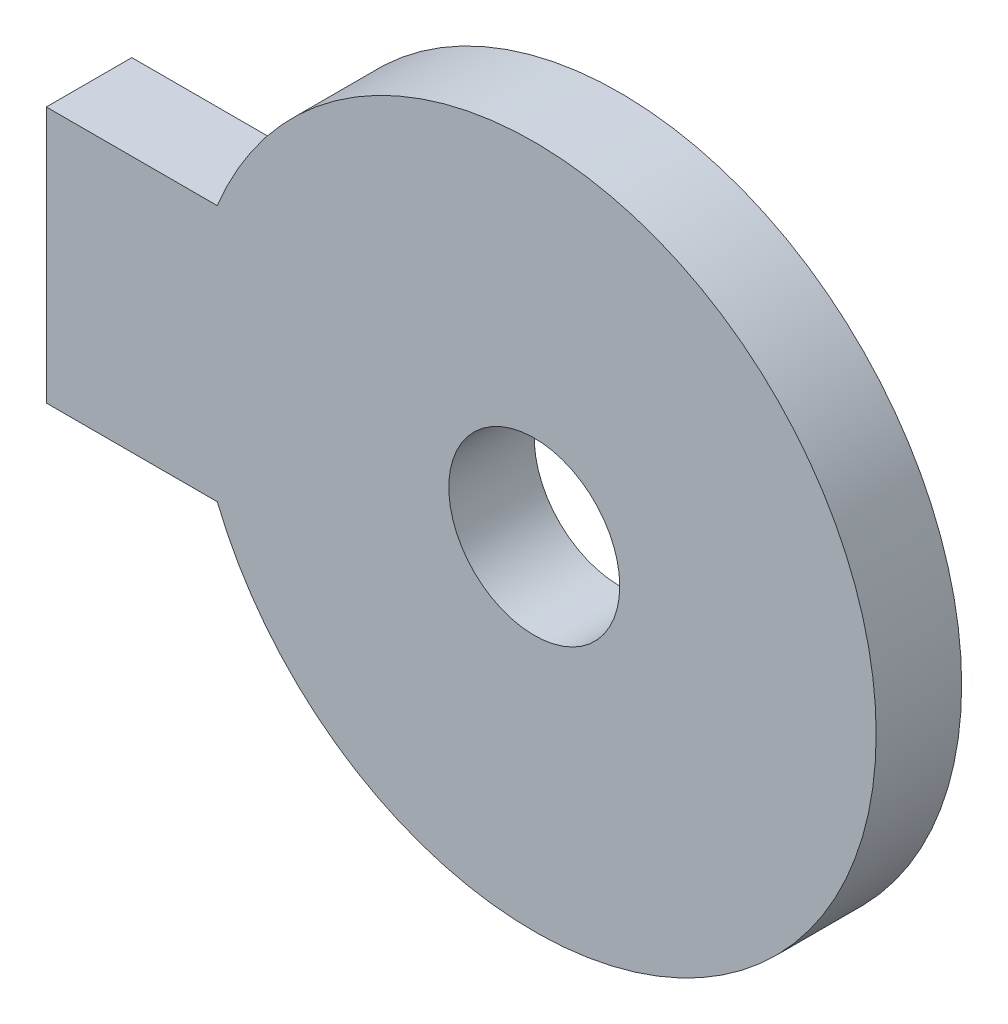
ISO-10303-21;
HEADER;
FILE_DESCRIPTION(('STEP AP214'),'2;1');
FILE_NAME('part.step','',(''),(''),'','','');
FILE_SCHEMA(('AUTOMOTIVE_DESIGN { 1 0 10303 214 1 1 1 1 }'));
ENDSEC;
DATA;
#1=APPLICATION_CONTEXT('core data for automotive mechanical design processes');
#2=APPLICATION_PROTOCOL_DEFINITION('international standard','automotive_design',2000,#1);
#3=PRODUCT_CONTEXT('',#1,'mechanical');
#4=PRODUCT('Part','Part','',(#3));
#5=PRODUCT_RELATED_PRODUCT_CATEGORY('part','',(#4));
#6=PRODUCT_DEFINITION_FORMATION('','',#4);
#7=PRODUCT_DEFINITION_CONTEXT('part definition',#1,'design');
#8=PRODUCT_DEFINITION('design','',#6,#7);
#9=PRODUCT_DEFINITION_SHAPE('','',#8);
#10=(LENGTH_UNIT() NAMED_UNIT(*) SI_UNIT(.MILLI.,.METRE.));
#11=(NAMED_UNIT(*) PLANE_ANGLE_UNIT() SI_UNIT($,.RADIAN.));
#12=(NAMED_UNIT(*) SI_UNIT($,.STERADIAN.) SOLID_ANGLE_UNIT());
#13=UNCERTAINTY_MEASURE_WITH_UNIT(LENGTH_MEASURE(1.E-05),#10,'distance_accuracy_value','');
#14=(GEOMETRIC_REPRESENTATION_CONTEXT(3) GLOBAL_UNCERTAINTY_ASSIGNED_CONTEXT((#13)) GLOBAL_UNIT_ASSIGNED_CONTEXT((#10,
#11,#12)) REPRESENTATION_CONTEXT('',''));
#15=CARTESIAN_POINT('',(0.,0.,0.));
#16=DIRECTION('',(0.,0.,1.));
#17=DIRECTION('',(1.,0.,0.));
#18=AXIS2_PLACEMENT_3D('',#15,#16,#17);
#19=CARTESIAN_POINT('',(0.,0.,5.));
#20=DIRECTION('',(0.,0.,1.));
#21=DIRECTION('',(1.,0.,0.));
#22=AXIS2_PLACEMENT_3D('',#19,#20,#21);
#23=PLANE('',#22);
#24=CARTESIAN_POINT('',(0.,0.,5.));
#25=DIRECTION('',(0.,0.,1.));
#26=DIRECTION('',(1.,0.,0.));
#27=AXIS2_PLACEMENT_3D('',#24,#25,#26);
#28=CIRCLE('',#27,20.);
#29=CARTESIAN_POINT('',(-18.5404962177392,-7.5,5.));
#30=VERTEX_POINT('',#29);
#31=CARTESIAN_POINT('',(-18.5404962177392,7.5,5.));
#32=VERTEX_POINT('',#31);
#33=EDGE_CURVE('E85',#30,#32,#28,.T.);
#34=ORIENTED_EDGE('',*,*,#33,.T.);
#35=DIRECTION('',(-1.,0.,0.));
#36=VECTOR('',#35,1.);
#37=CARTESIAN_POINT('',(-28.5404962177392,7.5,5.));
#38=LINE('',#37,#36);
#39=CARTESIAN_POINT('',(-28.5404962177392,7.5,5.));
#40=VERTEX_POINT('',#39);
#41=EDGE_CURVE('E80',#32,#40,#38,.T.);
#42=ORIENTED_EDGE('',*,*,#41,.T.);
#43=DIRECTION('',(0.,-1.,0.));
#44=VECTOR('',#43,1.);
#45=CARTESIAN_POINT('',(-28.5404962177392,-7.5,5.));
#46=LINE('',#45,#44);
#47=CARTESIAN_POINT('',(-28.5404962177392,-7.5,5.));
#48=VERTEX_POINT('',#47);
#49=EDGE_CURVE('E83',#40,#48,#46,.T.);
#50=ORIENTED_EDGE('',*,*,#49,.T.);
#51=DIRECTION('',(1.,0.,0.));
#52=VECTOR('',#51,1.);
#53=CARTESIAN_POINT('',(-28.5404962177392,-7.5,5.));
#54=LINE('',#53,#52);
#55=EDGE_CURVE('E50',#48,#30,#54,.T.);
#56=ORIENTED_EDGE('',*,*,#55,.T.);
#57=EDGE_LOOP('',(#34,#42,#50,#56));
#58=FACE_BOUND('',#57,.T.);
#59=CARTESIAN_POINT('',(0.,0.,5.));
#60=DIRECTION('',(0.,0.,1.));
#61=DIRECTION('',(1.,0.,0.));
#62=AXIS2_PLACEMENT_3D('',#59,#60,#61);
#63=CIRCLE('',#62,5.);
#64=CARTESIAN_POINT('',(5.,0.,5.));
#65=VERTEX_POINT('',#64);
#66=EDGE_CURVE('E100',#65,#65,#63,.T.);
#67=ORIENTED_EDGE('',*,*,#66,.F.);
#68=EDGE_LOOP('',(#67));
#69=FACE_BOUND('',#68,.T.);
#70=ADVANCED_FACE('F33',(#58,#69),#23,.T.);
#71=CARTESIAN_POINT('',(0.,0.,0.));
#72=DIRECTION('',(0.,0.,1.));
#73=DIRECTION('',(1.,0.,0.));
#74=AXIS2_PLACEMENT_3D('',#71,#72,#73);
#75=PLANE('',#74);
#76=CARTESIAN_POINT('',(0.,0.,0.));
#77=DIRECTION('',(0.,0.,1.));
#78=DIRECTION('',(1.,0.,0.));
#79=AXIS2_PLACEMENT_3D('',#76,#77,#78);
#80=CIRCLE('',#79,20.);
#81=CARTESIAN_POINT('',(-18.5404962177392,-7.5,0.));
#82=VERTEX_POINT('',#81);
#83=CARTESIAN_POINT('',(-18.5404962177392,7.5,0.));
#84=VERTEX_POINT('',#83);
#85=EDGE_CURVE('E97',#82,#84,#80,.T.);
#86=ORIENTED_EDGE('',*,*,#85,.F.);
#87=DIRECTION('',(1.,0.,0.));
#88=VECTOR('',#87,1.);
#89=CARTESIAN_POINT('',(-28.5404962177392,-7.5,0.));
#90=LINE('',#89,#88);
#91=CARTESIAN_POINT('',(-28.5404962177392,-7.5,0.));
#92=VERTEX_POINT('',#91);
#93=EDGE_CURVE('E73',#92,#82,#90,.T.);
#94=ORIENTED_EDGE('',*,*,#93,.F.);
#95=DIRECTION('',(0.,-1.,0.));
#96=VECTOR('',#95,1.);
#97=CARTESIAN_POINT('',(-28.5404962177392,-7.5,0.));
#98=LINE('',#97,#96);
#99=CARTESIAN_POINT('',(-28.5404962177392,7.5,0.));
#100=VERTEX_POINT('',#99);
#101=EDGE_CURVE('E67',#100,#92,#98,.T.);
#102=ORIENTED_EDGE('',*,*,#101,.F.);
#103=DIRECTION('',(-1.,0.,0.));
#104=VECTOR('',#103,1.);
#105=CARTESIAN_POINT('',(-28.5404962177392,7.5,0.));
#106=LINE('',#105,#104);
#107=EDGE_CURVE('E89',#84,#100,#106,.T.);
#108=ORIENTED_EDGE('',*,*,#107,.F.);
#109=EDGE_LOOP('',(#86,#94,#102,#108));
#110=FACE_BOUND('',#109,.T.);
#111=CARTESIAN_POINT('',(0.,0.,0.));
#112=DIRECTION('',(0.,0.,1.));
#113=DIRECTION('',(1.,0.,0.));
#114=AXIS2_PLACEMENT_3D('',#111,#112,#113);
#115=CIRCLE('',#114,5.);
#116=CARTESIAN_POINT('',(5.,0.,0.));
#117=VERTEX_POINT('',#116);
#118=EDGE_CURVE('E112',#117,#117,#115,.T.);
#119=ORIENTED_EDGE('',*,*,#118,.T.);
#120=EDGE_LOOP('',(#119));
#121=FACE_BOUND('',#120,.T.);
#122=ADVANCED_FACE('F108',(#110,#121),#75,.F.);
#123=CARTESIAN_POINT('',(0.,0.,5.));
#124=DIRECTION('',(0.,0.,-1.));
#125=DIRECTION('',(-1.,0.,0.));
#126=AXIS2_PLACEMENT_3D('',#123,#124,#125);
#127=CYLINDRICAL_SURFACE('',#126,20.);
#128=ORIENTED_EDGE('',*,*,#85,.T.);
#129=DIRECTION('',(0.,0.,-1.));
#130=VECTOR('',#129,1.);
#131=CARTESIAN_POINT('',(-18.5404962177392,7.5,5.));
#132=LINE('',#131,#130);
#133=EDGE_CURVE('E11',#32,#84,#132,.T.);
#134=ORIENTED_EDGE('',*,*,#133,.F.);
#135=ORIENTED_EDGE('',*,*,#33,.F.);
#136=DIRECTION('',(0.,0.,-1.));
#137=VECTOR('',#136,1.);
#138=CARTESIAN_POINT('',(-18.5404962177392,-7.5,5.));
#139=LINE('',#138,#137);
#140=EDGE_CURVE('E93',#30,#82,#139,.T.);
#141=ORIENTED_EDGE('',*,*,#140,.T.);
#142=EDGE_LOOP('',(#128,#134,#135,#141));
#143=FACE_BOUND('',#142,.T.);
#144=ADVANCED_FACE('F35',(#143),#127,.T.);
#145=CARTESIAN_POINT('',(-28.5404962177392,7.5,5.));
#146=DIRECTION('',(0.,-1.,0.));
#147=DIRECTION('',(0.,0.,-1.));
#148=AXIS2_PLACEMENT_3D('',#145,#146,#147);
#149=PLANE('',#148);
#150=ORIENTED_EDGE('',*,*,#107,.T.);
#151=DIRECTION('',(0.,0.,-1.));
#152=VECTOR('',#151,1.);
#153=CARTESIAN_POINT('',(-28.5404962177392,7.5,5.));
#154=LINE('',#153,#152);
#155=EDGE_CURVE('E42',#40,#100,#154,.T.);
#156=ORIENTED_EDGE('',*,*,#155,.F.);
#157=ORIENTED_EDGE('',*,*,#41,.F.);
#158=ORIENTED_EDGE('',*,*,#133,.T.);
#159=EDGE_LOOP('',(#150,#156,#157,#158));
#160=FACE_BOUND('',#159,.T.);
#161=ADVANCED_FACE('F88',(#160),#149,.F.);
#162=CARTESIAN_POINT('',(-28.5404962177392,-7.5,5.));
#163=DIRECTION('',(1.,0.,0.));
#164=DIRECTION('',(0.,0.,-1.));
#165=AXIS2_PLACEMENT_3D('',#162,#163,#164);
#166=PLANE('',#165);
#167=ORIENTED_EDGE('',*,*,#101,.T.);
#168=DIRECTION('',(0.,0.,-1.));
#169=VECTOR('',#168,1.);
#170=CARTESIAN_POINT('',(-28.5404962177392,-7.5,5.));
#171=LINE('',#170,#169);
#172=EDGE_CURVE('E90',#48,#92,#171,.T.);
#173=ORIENTED_EDGE('',*,*,#172,.F.);
#174=ORIENTED_EDGE('',*,*,#49,.F.);
#175=ORIENTED_EDGE('',*,*,#155,.T.);
#176=EDGE_LOOP('',(#167,#173,#174,#175));
#177=FACE_BOUND('',#176,.T.);
#178=ADVANCED_FACE('F91',(#177),#166,.F.);
#179=CARTESIAN_POINT('',(-28.5404962177392,-7.5,5.));
#180=DIRECTION('',(0.,1.,0.));
#181=DIRECTION('',(0.,0.,1.));
#182=AXIS2_PLACEMENT_3D('',#179,#180,#181);
#183=PLANE('',#182);
#184=ORIENTED_EDGE('',*,*,#93,.T.);
#185=ORIENTED_EDGE('',*,*,#140,.F.);
#186=ORIENTED_EDGE('',*,*,#55,.F.);
#187=ORIENTED_EDGE('',*,*,#172,.T.);
#188=EDGE_LOOP('',(#184,#185,#186,#187));
#189=FACE_BOUND('',#188,.T.);
#190=ADVANCED_FACE('F105',(#189),#183,.F.);
#191=CARTESIAN_POINT('',(0.,0.,5.));
#192=DIRECTION('',(0.,0.,-1.));
#193=DIRECTION('',(-1.,0.,0.));
#194=AXIS2_PLACEMENT_3D('',#191,#192,#193);
#195=CYLINDRICAL_SURFACE('',#194,5.);
#196=ORIENTED_EDGE('',*,*,#66,.T.);
#197=EDGE_LOOP('',(#196));
#198=FACE_BOUND('',#197,.T.);
#199=ORIENTED_EDGE('',*,*,#118,.F.);
#200=EDGE_LOOP('',(#199));
#201=FACE_BOUND('',#200,.T.);
#202=ADVANCED_FACE('F118',(#198,#201),#195,.F.);
#203=CLOSED_SHELL('',(#70,#122,#144,#161,#178,#190,#202));
#204=MANIFOLD_SOLID_BREP('B2',#203);
#205=ADVANCED_BREP_SHAPE_REPRESENTATION('',(#18,#204),#14);
#206=SHAPE_DEFINITION_REPRESENTATION(#9,#205);
ENDSEC;
END-ISO-10303-21;
